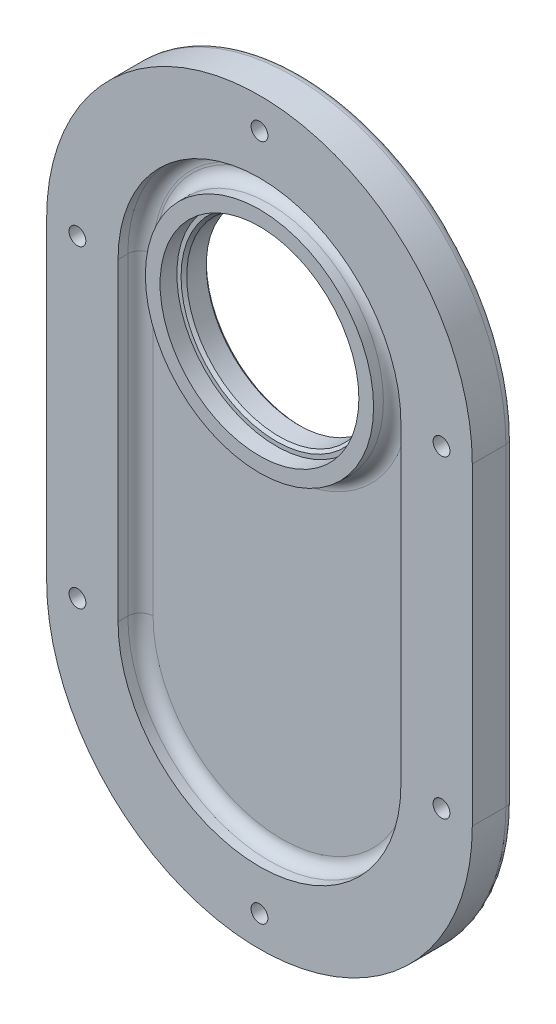
ISO-10303-21;
HEADER;
FILE_DESCRIPTION(('STEP AP214'),'2;1');
FILE_NAME('part.step','',(''),(''),'','','');
FILE_SCHEMA(('AUTOMOTIVE_DESIGN { 1 0 10303 214 1 1 1 1 }'));
ENDSEC;
DATA;
#1=APPLICATION_CONTEXT('core data for automotive mechanical design processes');
#2=APPLICATION_PROTOCOL_DEFINITION('international standard','automotive_design',2000,#1);
#3=PRODUCT_CONTEXT('',#1,'mechanical');
#4=PRODUCT('Part','Part','',(#3));
#5=PRODUCT_RELATED_PRODUCT_CATEGORY('part','',(#4));
#6=PRODUCT_DEFINITION_FORMATION('','',#4);
#7=PRODUCT_DEFINITION_CONTEXT('part definition',#1,'design');
#8=PRODUCT_DEFINITION('design','',#6,#7);
#9=PRODUCT_DEFINITION_SHAPE('','',#8);
#10=(LENGTH_UNIT() NAMED_UNIT(*) SI_UNIT(.MILLI.,.METRE.));
#11=(NAMED_UNIT(*) PLANE_ANGLE_UNIT() SI_UNIT($,.RADIAN.));
#12=(NAMED_UNIT(*) SI_UNIT($,.STERADIAN.) SOLID_ANGLE_UNIT());
#13=UNCERTAINTY_MEASURE_WITH_UNIT(LENGTH_MEASURE(1.E-05),#10,'distance_accuracy_value','');
#14=(GEOMETRIC_REPRESENTATION_CONTEXT(3) GLOBAL_UNCERTAINTY_ASSIGNED_CONTEXT((#13)) GLOBAL_UNIT_ASSIGNED_CONTEXT((#10,
#11,#12)) REPRESENTATION_CONTEXT('',''));
#15=CARTESIAN_POINT('',(0.,0.,0.));
#16=DIRECTION('',(0.,0.,1.));
#17=DIRECTION('',(1.,0.,0.));
#18=AXIS2_PLACEMENT_3D('',#15,#16,#17);
#19=CARTESIAN_POINT('',(0.,0.,0.));
#20=DIRECTION('',(0.,0.,1.));
#21=DIRECTION('',(1.,0.,0.));
#22=AXIS2_PLACEMENT_3D('',#19,#20,#21);
#23=PLANE('',#22);
#24=CARTESIAN_POINT('',(65.,0.,0.));
#25=DIRECTION('',(0.,0.,-1.));
#26=DIRECTION('',(-1.,0.,0.));
#27=AXIS2_PLACEMENT_3D('',#24,#25,#26);
#28=CIRCLE('',#27,7.00000000000001);
#29=CARTESIAN_POINT('',(58.,0.,0.));
#30=VERTEX_POINT('',#29);
#31=EDGE_CURVE('E424',#30,#30,#28,.T.);
#32=ORIENTED_EDGE('',*,*,#31,.F.);
#33=EDGE_LOOP('',(#32));
#34=FACE_BOUND('',#33,.T.);
#35=CARTESIAN_POINT('',(65.,-112.,0.));
#36=DIRECTION('',(0.,0.,-1.));
#37=DIRECTION('',(-1.,0.,0.));
#38=AXIS2_PLACEMENT_3D('',#35,#36,#37);
#39=CIRCLE('',#38,7.00000000000001);
#40=CARTESIAN_POINT('',(58.,-112.,0.));
#41=VERTEX_POINT('',#40);
#42=EDGE_CURVE('E434',#41,#41,#39,.T.);
#43=ORIENTED_EDGE('',*,*,#42,.F.);
#44=EDGE_LOOP('',(#43));
#45=FACE_BOUND('',#44,.T.);
#46=CARTESIAN_POINT('',(-65.,-112.,0.));
#47=DIRECTION('',(0.,0.,-1.));
#48=DIRECTION('',(-1.,0.,0.));
#49=AXIS2_PLACEMENT_3D('',#46,#47,#48);
#50=CIRCLE('',#49,7.00000000000001);
#51=CARTESIAN_POINT('',(-72.,-112.,0.));
#52=VERTEX_POINT('',#51);
#53=EDGE_CURVE('E458',#52,#52,#50,.T.);
#54=ORIENTED_EDGE('',*,*,#53,.F.);
#55=EDGE_LOOP('',(#54));
#56=FACE_BOUND('',#55,.T.);
#57=CARTESIAN_POINT('',(0.,65.,0.));
#58=DIRECTION('',(0.,0.,-1.));
#59=DIRECTION('',(-1.,0.,0.));
#60=AXIS2_PLACEMENT_3D('',#57,#58,#59);
#61=CIRCLE('',#60,7.00000000000001);
#62=CARTESIAN_POINT('',(-7.00000000000001,65.,0.));
#63=VERTEX_POINT('',#62);
#64=EDGE_CURVE('E482',#63,#63,#61,.T.);
#65=ORIENTED_EDGE('',*,*,#64,.F.);
#66=EDGE_LOOP('',(#65));
#67=FACE_BOUND('',#66,.T.);
#68=CARTESIAN_POINT('',(0.,0.,0.));
#69=DIRECTION('',(0.,0.,1.));
#70=DIRECTION('',(1.,0.,0.));
#71=AXIS2_PLACEMENT_3D('',#68,#69,#70);
#72=CIRCLE('',#71,73.);
#73=CARTESIAN_POINT('',(-73.,0.,0.));
#74=VERTEX_POINT('',#73);
#75=CARTESIAN_POINT('',(73.,0.,0.));
#76=VERTEX_POINT('',#75);
#77=EDGE_CURVE('E234',#74,#76,#72,.F.);
#78=ORIENTED_EDGE('',*,*,#77,.T.);
#79=DIRECTION('',(0.,1.,0.));
#80=VECTOR('',#79,1.);
#81=CARTESIAN_POINT('',(73.,0.,0.));
#82=LINE('',#81,#80);
#83=CARTESIAN_POINT('',(73.,-112.,0.));
#84=VERTEX_POINT('',#83);
#85=EDGE_CURVE('E240',#76,#84,#82,.F.);
#86=ORIENTED_EDGE('',*,*,#85,.T.);
#87=CARTESIAN_POINT('',(0.,-112.,0.));
#88=DIRECTION('',(0.,0.,1.));
#89=DIRECTION('',(1.,0.,0.));
#90=AXIS2_PLACEMENT_3D('',#87,#88,#89);
#91=CIRCLE('',#90,73.);
#92=CARTESIAN_POINT('',(-73.,-112.,0.));
#93=VERTEX_POINT('',#92);
#94=EDGE_CURVE('E238',#84,#93,#91,.F.);
#95=ORIENTED_EDGE('',*,*,#94,.T.);
#96=DIRECTION('',(0.,-1.,0.));
#97=VECTOR('',#96,1.);
#98=CARTESIAN_POINT('',(-73.,0.,0.));
#99=LINE('',#98,#97);
#100=EDGE_CURVE('E236',#93,#74,#99,.F.);
#101=ORIENTED_EDGE('',*,*,#100,.T.);
#102=EDGE_LOOP('',(#78,#86,#95,#101));
#103=FACE_BOUND('',#102,.T.);
#104=CARTESIAN_POINT('',(0.,0.,0.));
#105=DIRECTION('',(0.,0.,1.));
#106=DIRECTION('',(1.,0.,0.));
#107=AXIS2_PLACEMENT_3D('',#104,#105,#106);
#108=CIRCLE('',#107,34.);
#109=CARTESIAN_POINT('',(34.,0.,0.));
#110=VERTEX_POINT('',#109);
#111=EDGE_CURVE('E194',#110,#110,#108,.T.);
#112=ORIENTED_EDGE('',*,*,#111,.T.);
#113=EDGE_LOOP('',(#112));
#114=FACE_BOUND('',#113,.T.);
#115=CARTESIAN_POINT('',(0.,-177.,0.));
#116=DIRECTION('',(0.,0.,-1.));
#117=DIRECTION('',(-1.,0.,0.));
#118=AXIS2_PLACEMENT_3D('',#115,#116,#117);
#119=CIRCLE('',#118,7.00000000000001);
#120=CARTESIAN_POINT('',(-7.00000000000002,-177.,0.));
#121=VERTEX_POINT('',#120);
#122=EDGE_CURVE('E470',#121,#121,#119,.T.);
#123=ORIENTED_EDGE('',*,*,#122,.F.);
#124=EDGE_LOOP('',(#123));
#125=FACE_BOUND('',#124,.T.);
#126=CARTESIAN_POINT('',(-65.,0.,0.));
#127=DIRECTION('',(0.,0.,-1.));
#128=DIRECTION('',(-1.,0.,0.));
#129=AXIS2_PLACEMENT_3D('',#126,#127,#128);
#130=CIRCLE('',#129,7.00000000000001);
#131=CARTESIAN_POINT('',(-72.,0.,0.));
#132=VERTEX_POINT('',#131);
#133=EDGE_CURVE('E446',#132,#132,#130,.T.);
#134=ORIENTED_EDGE('',*,*,#133,.F.);
#135=EDGE_LOOP('',(#134));
#136=FACE_BOUND('',#135,.T.);
#137=ADVANCED_FACE('F41',(#34,#45,#56,#67,#103,#114,#125,#136),#23,.F.);
#138=CARTESIAN_POINT('',(0.,0.,15.));
#139=DIRECTION('',(0.,0.,1.));
#140=DIRECTION('',(1.,0.,0.));
#141=AXIS2_PLACEMENT_3D('',#138,#139,#140);
#142=PLANE('',#141);
#143=CARTESIAN_POINT('',(65.,0.,15.));
#144=DIRECTION('',(0.,0.,-1.));
#145=DIRECTION('',(-1.,0.,0.));
#146=AXIS2_PLACEMENT_3D('',#143,#144,#145);
#147=CIRCLE('',#146,3.00000000000002);
#148=CARTESIAN_POINT('',(62.,0.,15.));
#149=VERTEX_POINT('',#148);
#150=EDGE_CURVE('E431',#149,#149,#147,.T.);
#151=ORIENTED_EDGE('',*,*,#150,.T.);
#152=EDGE_LOOP('',(#151));
#153=FACE_BOUND('',#152,.T.);
#154=CARTESIAN_POINT('',(65.,-112.,15.));
#155=DIRECTION('',(0.,0.,-1.));
#156=DIRECTION('',(-1.,0.,0.));
#157=AXIS2_PLACEMENT_3D('',#154,#155,#156);
#158=CIRCLE('',#157,3.00000000000002);
#159=CARTESIAN_POINT('',(62.,-112.,15.));
#160=VERTEX_POINT('',#159);
#161=EDGE_CURVE('E443',#160,#160,#158,.T.);
#162=ORIENTED_EDGE('',*,*,#161,.T.);
#163=EDGE_LOOP('',(#162));
#164=FACE_BOUND('',#163,.T.);
#165=CARTESIAN_POINT('',(-65.,0.,15.));
#166=DIRECTION('',(0.,0.,-1.));
#167=DIRECTION('',(-1.,0.,0.));
#168=AXIS2_PLACEMENT_3D('',#165,#166,#167);
#169=CIRCLE('',#168,3.00000000000001);
#170=CARTESIAN_POINT('',(-68.,0.,15.));
#171=VERTEX_POINT('',#170);
#172=EDGE_CURVE('E455',#171,#171,#169,.T.);
#173=ORIENTED_EDGE('',*,*,#172,.T.);
#174=EDGE_LOOP('',(#173));
#175=FACE_BOUND('',#174,.T.);
#176=CARTESIAN_POINT('',(0.,0.,15.));
#177=DIRECTION('',(0.,0.,1.));
#178=DIRECTION('',(1.,0.,0.));
#179=AXIS2_PLACEMENT_3D('',#176,#177,#178);
#180=CIRCLE('',#179,76.);
#181=CARTESIAN_POINT('',(76.,0.,15.));
#182=VERTEX_POINT('',#181);
#183=CARTESIAN_POINT('',(-76.,0.,15.));
#184=VERTEX_POINT('',#183);
#185=EDGE_CURVE('E165',#182,#184,#180,.T.);
#186=ORIENTED_EDGE('',*,*,#185,.T.);
#187=DIRECTION('',(0.,-1.,0.));
#188=VECTOR('',#187,1.);
#189=CARTESIAN_POINT('',(-76.,0.,15.));
#190=LINE('',#189,#188);
#191=CARTESIAN_POINT('',(-76.,-112.,15.));
#192=VERTEX_POINT('',#191);
#193=EDGE_CURVE('E170',#184,#192,#190,.T.);
#194=ORIENTED_EDGE('',*,*,#193,.T.);
#195=CARTESIAN_POINT('',(0.,-112.,15.));
#196=DIRECTION('',(0.,0.,1.));
#197=DIRECTION('',(1.,0.,0.));
#198=AXIS2_PLACEMENT_3D('',#195,#196,#197);
#199=CIRCLE('',#198,76.);
#200=CARTESIAN_POINT('',(76.,-112.,15.));
#201=VERTEX_POINT('',#200);
#202=EDGE_CURVE('E172',#192,#201,#199,.T.);
#203=ORIENTED_EDGE('',*,*,#202,.T.);
#204=DIRECTION('',(0.,1.,0.));
#205=VECTOR('',#204,1.);
#206=CARTESIAN_POINT('',(76.,0.,15.));
#207=LINE('',#206,#205);
#208=EDGE_CURVE('E174',#201,#182,#207,.T.);
#209=ORIENTED_EDGE('',*,*,#208,.T.);
#210=EDGE_LOOP('',(#186,#194,#203,#209));
#211=FACE_BOUND('',#210,.T.);
#212=CARTESIAN_POINT('',(0.,0.,15.));
#213=DIRECTION('',(0.,0.,1.));
#214=DIRECTION('',(1.,0.,0.));
#215=AXIS2_PLACEMENT_3D('',#212,#213,#214);
#216=CIRCLE('',#215,50.5);
#217=CARTESIAN_POINT('',(50.5,0.,15.));
#218=VERTEX_POINT('',#217);
#219=CARTESIAN_POINT('',(-50.5,0.,15.));
#220=VERTEX_POINT('',#219);
#221=EDGE_CURVE('E153',#218,#220,#216,.T.);
#222=ORIENTED_EDGE('',*,*,#221,.F.);
#223=DIRECTION('',(0.,1.,0.));
#224=VECTOR('',#223,1.);
#225=CARTESIAN_POINT('',(50.5,0.,15.));
#226=LINE('',#225,#224);
#227=CARTESIAN_POINT('',(50.5,-112.,15.));
#228=VERTEX_POINT('',#227);
#229=EDGE_CURVE('E158',#228,#218,#226,.T.);
#230=ORIENTED_EDGE('',*,*,#229,.F.);
#231=CARTESIAN_POINT('',(0.,-112.,15.));
#232=DIRECTION('',(0.,0.,1.));
#233=DIRECTION('',(1.,0.,0.));
#234=AXIS2_PLACEMENT_3D('',#231,#232,#233);
#235=CIRCLE('',#234,50.5);
#236=CARTESIAN_POINT('',(-50.5,-112.,15.));
#237=VERTEX_POINT('',#236);
#238=EDGE_CURVE('E137',#237,#228,#235,.T.);
#239=ORIENTED_EDGE('',*,*,#238,.F.);
#240=DIRECTION('',(0.,-1.,0.));
#241=VECTOR('',#240,1.);
#242=CARTESIAN_POINT('',(-50.5,0.,15.));
#243=LINE('',#242,#241);
#244=EDGE_CURVE('E147',#220,#237,#243,.T.);
#245=ORIENTED_EDGE('',*,*,#244,.F.);
#246=EDGE_LOOP('',(#222,#230,#239,#245));
#247=FACE_BOUND('',#246,.T.);
#248=CARTESIAN_POINT('',(0.,65.,15.));
#249=DIRECTION('',(0.,0.,-1.));
#250=DIRECTION('',(-1.,0.,0.));
#251=AXIS2_PLACEMENT_3D('',#248,#249,#250);
#252=CIRCLE('',#251,3.00000000000001);
#253=CARTESIAN_POINT('',(-3.00000000000001,65.,15.));
#254=VERTEX_POINT('',#253);
#255=EDGE_CURVE('E249',#254,#254,#252,.T.);
#256=ORIENTED_EDGE('',*,*,#255,.T.);
#257=EDGE_LOOP('',(#256));
#258=FACE_BOUND('',#257,.T.);
#259=CARTESIAN_POINT('',(0.,-177.,15.));
#260=DIRECTION('',(0.,0.,-1.));
#261=DIRECTION('',(-1.,0.,0.));
#262=AXIS2_PLACEMENT_3D('',#259,#260,#261);
#263=CIRCLE('',#262,3.00000000000001);
#264=CARTESIAN_POINT('',(-3.00000000000002,-177.,15.));
#265=VERTEX_POINT('',#264);
#266=EDGE_CURVE('E479',#265,#265,#263,.T.);
#267=ORIENTED_EDGE('',*,*,#266,.T.);
#268=EDGE_LOOP('',(#267));
#269=FACE_BOUND('',#268,.T.);
#270=CARTESIAN_POINT('',(-65.,-112.,15.));
#271=DIRECTION('',(0.,0.,-1.));
#272=DIRECTION('',(-1.,0.,0.));
#273=AXIS2_PLACEMENT_3D('',#270,#271,#272);
#274=CIRCLE('',#273,3.00000000000001);
#275=CARTESIAN_POINT('',(-68.,-112.,15.));
#276=VERTEX_POINT('',#275);
#277=EDGE_CURVE('E467',#276,#276,#274,.T.);
#278=ORIENTED_EDGE('',*,*,#277,.T.);
#279=EDGE_LOOP('',(#278));
#280=FACE_BOUND('',#279,.T.);
#281=ADVANCED_FACE('F155',(#153,#164,#175,#211,#247,#258,#269,#280),#142,.T.);
#282=CARTESIAN_POINT('',(0.,0.,15.));
#283=DIRECTION('',(0.,0.,-1.));
#284=DIRECTION('',(-1.,0.,0.));
#285=AXIS2_PLACEMENT_3D('',#282,#283,#284);
#286=CYLINDRICAL_SURFACE('',#285,76.);
#287=DIRECTION('',(0.,0.,-1.));
#288=VECTOR('',#287,1.);
#289=CARTESIAN_POINT('',(76.,0.,15.));
#290=LINE('',#289,#288);
#291=CARTESIAN_POINT('',(76.,0.,3.));
#292=VERTEX_POINT('',#291);
#293=EDGE_CURVE('E176',#182,#292,#290,.T.);
#294=ORIENTED_EDGE('',*,*,#293,.T.);
#295=CARTESIAN_POINT('',(0.,0.,3.));
#296=DIRECTION('',(0.,0.,1.));
#297=DIRECTION('',(1.,0.,0.));
#298=AXIS2_PLACEMENT_3D('',#295,#296,#297);
#299=CIRCLE('',#298,76.);
#300=CARTESIAN_POINT('',(-76.,0.,3.));
#301=VERTEX_POINT('',#300);
#302=EDGE_CURVE('E11',#292,#301,#299,.T.);
#303=ORIENTED_EDGE('',*,*,#302,.T.);
#304=DIRECTION('',(0.,0.,-1.));
#305=VECTOR('',#304,1.);
#306=CARTESIAN_POINT('',(-76.,0.,15.));
#307=LINE('',#306,#305);
#308=EDGE_CURVE('E183',#184,#301,#307,.T.);
#309=ORIENTED_EDGE('',*,*,#308,.F.);
#310=ORIENTED_EDGE('',*,*,#185,.F.);
#311=EDGE_LOOP('',(#294,#303,#309,#310));
#312=FACE_BOUND('',#311,.T.);
#313=ADVANCED_FACE('F278',(#312),#286,.T.);
#314=CARTESIAN_POINT('',(-76.,0.,15.));
#315=DIRECTION('',(1.,0.,0.));
#316=DIRECTION('',(0.,1.,0.));
#317=AXIS2_PLACEMENT_3D('',#314,#315,#316);
#318=PLANE('',#317);
#319=ORIENTED_EDGE('',*,*,#308,.T.);
#320=DIRECTION('',(0.,-1.,0.));
#321=VECTOR('',#320,1.);
#322=CARTESIAN_POINT('',(-76.,0.,3.));
#323=LINE('',#322,#321);
#324=CARTESIAN_POINT('',(-76.,-112.,3.));
#325=VERTEX_POINT('',#324);
#326=EDGE_CURVE('E50',#301,#325,#323,.T.);
#327=ORIENTED_EDGE('',*,*,#326,.T.);
#328=DIRECTION('',(0.,0.,-1.));
#329=VECTOR('',#328,1.);
#330=CARTESIAN_POINT('',(-76.,-112.,15.));
#331=LINE('',#330,#329);
#332=EDGE_CURVE('E181',#192,#325,#331,.T.);
#333=ORIENTED_EDGE('',*,*,#332,.F.);
#334=ORIENTED_EDGE('',*,*,#193,.F.);
#335=EDGE_LOOP('',(#319,#327,#333,#334));
#336=FACE_BOUND('',#335,.T.);
#337=ADVANCED_FACE('F283',(#336),#318,.F.);
#338=CARTESIAN_POINT('',(0.,-112.,15.));
#339=DIRECTION('',(0.,0.,-1.));
#340=DIRECTION('',(-1.,0.,0.));
#341=AXIS2_PLACEMENT_3D('',#338,#339,#340);
#342=CYLINDRICAL_SURFACE('',#341,76.);
#343=ORIENTED_EDGE('',*,*,#332,.T.);
#344=CARTESIAN_POINT('',(0.,-112.,3.));
#345=DIRECTION('',(0.,0.,1.));
#346=DIRECTION('',(1.,0.,0.));
#347=AXIS2_PLACEMENT_3D('',#344,#345,#346);
#348=CIRCLE('',#347,76.);
#349=CARTESIAN_POINT('',(76.,-112.,3.));
#350=VERTEX_POINT('',#349);
#351=EDGE_CURVE('E243',#325,#350,#348,.T.);
#352=ORIENTED_EDGE('',*,*,#351,.T.);
#353=DIRECTION('',(0.,0.,-1.));
#354=VECTOR('',#353,1.);
#355=CARTESIAN_POINT('',(76.,-112.,15.));
#356=LINE('',#355,#354);
#357=EDGE_CURVE('E178',#201,#350,#356,.T.);
#358=ORIENTED_EDGE('',*,*,#357,.F.);
#359=ORIENTED_EDGE('',*,*,#202,.F.);
#360=EDGE_LOOP('',(#343,#352,#358,#359));
#361=FACE_BOUND('',#360,.T.);
#362=ADVANCED_FACE('F282',(#361),#342,.T.);
#363=CARTESIAN_POINT('',(76.,0.,15.));
#364=DIRECTION('',(-1.,0.,0.));
#365=DIRECTION('',(0.,-1.,0.));
#366=AXIS2_PLACEMENT_3D('',#363,#364,#365);
#367=PLANE('',#366);
#368=ORIENTED_EDGE('',*,*,#357,.T.);
#369=DIRECTION('',(0.,1.,0.));
#370=VECTOR('',#369,1.);
#371=CARTESIAN_POINT('',(76.,0.,3.));
#372=LINE('',#371,#370);
#373=EDGE_CURVE('E220',#350,#292,#372,.T.);
#374=ORIENTED_EDGE('',*,*,#373,.T.);
#375=ORIENTED_EDGE('',*,*,#293,.F.);
#376=ORIENTED_EDGE('',*,*,#208,.F.);
#377=EDGE_LOOP('',(#368,#374,#375,#376));
#378=FACE_BOUND('',#377,.T.);
#379=ADVANCED_FACE('F274',(#378),#367,.F.);
#380=CARTESIAN_POINT('',(0.,0.,7.));
#381=DIRECTION('',(0.,0.,1.));
#382=DIRECTION('',(1.,0.,0.));
#383=AXIS2_PLACEMENT_3D('',#380,#381,#382);
#384=CYLINDRICAL_SURFACE('',#383,50.5);
#385=DIRECTION('',(0.,0.,1.));
#386=VECTOR('',#385,1.);
#387=CARTESIAN_POINT('',(-50.5,0.,7.));
#388=LINE('',#387,#386);
#389=CARTESIAN_POINT('',(-50.5,0.,11.5));
#390=VERTEX_POINT('',#389);
#391=EDGE_CURVE('E144',#390,#220,#388,.T.);
#392=ORIENTED_EDGE('',*,*,#391,.F.);
#393=CARTESIAN_POINT('',(0.,0.,11.5));
#394=DIRECTION('',(0.,0.,1.));
#395=DIRECTION('',(1.,0.,0.));
#396=AXIS2_PLACEMENT_3D('',#393,#394,#395);
#397=CIRCLE('',#396,50.5);
#398=CARTESIAN_POINT('',(50.5,0.,11.5));
#399=VERTEX_POINT('',#398);
#400=EDGE_CURVE('E215',#390,#399,#397,.F.);
#401=ORIENTED_EDGE('',*,*,#400,.T.);
#402=DIRECTION('',(0.,0.,1.));
#403=VECTOR('',#402,1.);
#404=CARTESIAN_POINT('',(50.5,0.,7.));
#405=LINE('',#404,#403);
#406=EDGE_CURVE('E163',#399,#218,#405,.T.);
#407=ORIENTED_EDGE('',*,*,#406,.T.);
#408=ORIENTED_EDGE('',*,*,#221,.T.);
#409=EDGE_LOOP('',(#392,#401,#407,#408));
#410=FACE_BOUND('',#409,.T.);
#411=ADVANCED_FACE('F307',(#410),#384,.F.);
#412=CARTESIAN_POINT('',(50.5,0.,7.));
#413=DIRECTION('',(1.,0.,0.));
#414=DIRECTION('',(0.,1.,0.));
#415=AXIS2_PLACEMENT_3D('',#412,#413,#414);
#416=PLANE('',#415);
#417=ORIENTED_EDGE('',*,*,#406,.F.);
#418=DIRECTION('',(0.,1.,0.));
#419=VECTOR('',#418,1.);
#420=CARTESIAN_POINT('',(50.5,0.,11.5));
#421=LINE('',#420,#419);
#422=CARTESIAN_POINT('',(50.5,-112.,11.5));
#423=VERTEX_POINT('',#422);
#424=EDGE_CURVE('E209',#399,#423,#421,.F.);
#425=ORIENTED_EDGE('',*,*,#424,.T.);
#426=DIRECTION('',(0.,0.,1.));
#427=VECTOR('',#426,1.);
#428=CARTESIAN_POINT('',(50.5,-112.,7.));
#429=LINE('',#428,#427);
#430=EDGE_CURVE('E143',#423,#228,#429,.T.);
#431=ORIENTED_EDGE('',*,*,#430,.T.);
#432=ORIENTED_EDGE('',*,*,#229,.T.);
#433=EDGE_LOOP('',(#417,#425,#431,#432));
#434=FACE_BOUND('',#433,.T.);
#435=ADVANCED_FACE('F312',(#434),#416,.F.);
#436=CARTESIAN_POINT('',(0.,-112.,7.));
#437=DIRECTION('',(0.,0.,1.));
#438=DIRECTION('',(1.,0.,0.));
#439=AXIS2_PLACEMENT_3D('',#436,#437,#438);
#440=CYLINDRICAL_SURFACE('',#439,50.5);
#441=ORIENTED_EDGE('',*,*,#430,.F.);
#442=CARTESIAN_POINT('',(0.,-112.,11.5));
#443=DIRECTION('',(0.,0.,1.));
#444=DIRECTION('',(1.,0.,0.));
#445=AXIS2_PLACEMENT_3D('',#442,#443,#444);
#446=CIRCLE('',#445,50.5);
#447=CARTESIAN_POINT('',(-50.5,-112.,11.5));
#448=VERTEX_POINT('',#447);
#449=EDGE_CURVE('E140',#423,#448,#446,.F.);
#450=ORIENTED_EDGE('',*,*,#449,.T.);
#451=DIRECTION('',(0.,0.,1.));
#452=VECTOR('',#451,1.);
#453=CARTESIAN_POINT('',(-50.5,-112.,7.));
#454=LINE('',#453,#452);
#455=EDGE_CURVE('E132',#448,#237,#454,.T.);
#456=ORIENTED_EDGE('',*,*,#455,.T.);
#457=ORIENTED_EDGE('',*,*,#238,.T.);
#458=EDGE_LOOP('',(#441,#450,#456,#457));
#459=FACE_BOUND('',#458,.T.);
#460=ADVANCED_FACE('F135',(#459),#440,.F.);
#461=CARTESIAN_POINT('',(-50.5,0.,7.));
#462=DIRECTION('',(-1.,0.,0.));
#463=DIRECTION('',(0.,-1.,0.));
#464=AXIS2_PLACEMENT_3D('',#461,#462,#463);
#465=PLANE('',#464);
#466=ORIENTED_EDGE('',*,*,#455,.F.);
#467=DIRECTION('',(0.,-1.,0.));
#468=VECTOR('',#467,1.);
#469=CARTESIAN_POINT('',(-50.5,0.,11.5));
#470=LINE('',#469,#468);
#471=EDGE_CURVE('E213',#448,#390,#470,.F.);
#472=ORIENTED_EDGE('',*,*,#471,.T.);
#473=ORIENTED_EDGE('',*,*,#391,.T.);
#474=ORIENTED_EDGE('',*,*,#244,.T.);
#475=EDGE_LOOP('',(#466,#472,#473,#474));
#476=FACE_BOUND('',#475,.T.);
#477=ADVANCED_FACE('F148',(#476),#465,.F.);
#478=CARTESIAN_POINT('',(0.,0.,7.));
#479=DIRECTION('',(0.,0.,1.));
#480=DIRECTION('',(1.,0.,0.));
#481=AXIS2_PLACEMENT_3D('',#478,#479,#480);
#482=PLANE('',#481);
#483=CARTESIAN_POINT('',(0.,-112.,7.));
#484=DIRECTION('',(0.,0.,1.));
#485=DIRECTION('',(1.,0.,0.));
#486=AXIS2_PLACEMENT_3D('',#483,#484,#485);
#487=CIRCLE('',#486,46.);
#488=CARTESIAN_POINT('',(-46.,-112.,7.));
#489=VERTEX_POINT('',#488);
#490=CARTESIAN_POINT('',(46.,-112.,7.));
#491=VERTEX_POINT('',#490);
#492=EDGE_CURVE('E204',#489,#491,#487,.T.);
#493=ORIENTED_EDGE('',*,*,#492,.T.);
#494=DIRECTION('',(0.,1.,0.));
#495=VECTOR('',#494,1.);
#496=CARTESIAN_POINT('',(46.,0.,7.));
#497=LINE('',#496,#495);
#498=CARTESIAN_POINT('',(46.,0.,7.));
#499=VERTEX_POINT('',#498);
#500=EDGE_CURVE('E206',#491,#499,#497,.T.);
#501=ORIENTED_EDGE('',*,*,#500,.T.);
#502=CARTESIAN_POINT('',(0.,0.,7.));
#503=DIRECTION('',(0.,0.,1.));
#504=DIRECTION('',(1.,0.,0.));
#505=AXIS2_PLACEMENT_3D('',#502,#503,#504);
#506=CIRCLE('',#505,46.);
#507=CARTESIAN_POINT('',(-46.,0.,7.));
#508=VERTEX_POINT('',#507);
#509=EDGE_CURVE('E200',#499,#508,#506,.T.);
#510=ORIENTED_EDGE('',*,*,#509,.T.);
#511=DIRECTION('',(0.,-1.,0.));
#512=VECTOR('',#511,1.);
#513=CARTESIAN_POINT('',(-46.,0.,7.));
#514=LINE('',#513,#512);
#515=EDGE_CURVE('E202',#508,#489,#514,.T.);
#516=ORIENTED_EDGE('',*,*,#515,.T.);
#517=EDGE_LOOP('',(#493,#501,#510,#516));
#518=FACE_BOUND('',#517,.T.);
#519=CARTESIAN_POINT('',(0.,0.,7.));
#520=DIRECTION('',(0.,0.,1.));
#521=DIRECTION('',(1.,0.,0.));
#522=AXIS2_PLACEMENT_3D('',#519,#520,#521);
#523=CIRCLE('',#522,45.25);
#524=CARTESIAN_POINT('',(45.25,0.,7.));
#525=VERTEX_POINT('',#524);
#526=EDGE_CURVE('E197',#525,#525,#523,.F.);
#527=ORIENTED_EDGE('',*,*,#526,.T.);
#528=EDGE_LOOP('',(#527));
#529=FACE_BOUND('',#528,.T.);
#530=ADVANCED_FACE('F323',(#518,#529),#482,.T.);
#531=CARTESIAN_POINT('',(0.,0.,7.));
#532=DIRECTION('',(0.,0.,1.));
#533=DIRECTION('',(1.,0.,0.));
#534=AXIS2_PLACEMENT_3D('',#531,#532,#533);
#535=CYLINDRICAL_SURFACE('',#534,40.75);
#536=CARTESIAN_POINT('',(0.,0.,11.5));
#537=DIRECTION('',(0.,0.,1.));
#538=DIRECTION('',(1.,0.,0.));
#539=AXIS2_PLACEMENT_3D('',#536,#537,#538);
#540=CIRCLE('',#539,40.75);
#541=CARTESIAN_POINT('',(40.75,0.,11.5));
#542=VERTEX_POINT('',#541);
#543=EDGE_CURVE('E217',#542,#542,#540,.T.);
#544=ORIENTED_EDGE('',*,*,#543,.T.);
#545=EDGE_LOOP('',(#544));
#546=FACE_BOUND('',#545,.T.);
#547=CARTESIAN_POINT('',(0.,0.,15.));
#548=DIRECTION('',(0.,0.,1.));
#549=DIRECTION('',(1.,0.,0.));
#550=AXIS2_PLACEMENT_3D('',#547,#548,#549);
#551=CIRCLE('',#550,40.75);
#552=CARTESIAN_POINT('',(40.75,0.,15.));
#553=VERTEX_POINT('',#552);
#554=EDGE_CURVE('E496',#553,#553,#551,.T.);
#555=ORIENTED_EDGE('',*,*,#554,.F.);
#556=EDGE_LOOP('',(#555));
#557=FACE_BOUND('',#556,.T.);
#558=ADVANCED_FACE('F328',(#546,#557),#535,.T.);
#559=CARTESIAN_POINT('',(0.,0.,15.));
#560=DIRECTION('',(0.,0.,1.));
#561=DIRECTION('',(1.,0.,0.));
#562=AXIS2_PLACEMENT_3D('',#559,#560,#561);
#563=CIRCLE('',#562,35.5);
#564=CARTESIAN_POINT('',(35.5,0.,15.));
#565=VERTEX_POINT('',#564);
#566=EDGE_CURVE('E231',#565,#565,#563,.T.);
#567=ORIENTED_EDGE('',*,*,#566,.F.);
#568=EDGE_LOOP('',(#567));
#569=FACE_BOUND('',#568,.T.);
#570=ORIENTED_EDGE('',*,*,#554,.T.);
#571=EDGE_LOOP('',(#570));
#572=FACE_BOUND('',#571,.T.);
#573=ADVANCED_FACE('F301',(#569,#572),#142,.T.);
#574=CARTESIAN_POINT('',(0.,0.,9.));
#575=DIRECTION('',(0.,0.,1.));
#576=DIRECTION('',(1.,0.,0.));
#577=AXIS2_PLACEMENT_3D('',#574,#575,#576);
#578=CYLINDRICAL_SURFACE('',#577,35.5);
#579=CARTESIAN_POINT('',(0.,0.,9.));
#580=DIRECTION('',(0.,0.,1.));
#581=DIRECTION('',(1.,0.,0.));
#582=AXIS2_PLACEMENT_3D('',#579,#580,#581);
#583=CIRCLE('',#582,35.5);
#584=CARTESIAN_POINT('',(35.5,0.,9.));
#585=VERTEX_POINT('',#584);
#586=EDGE_CURVE('E493',#585,#585,#583,.T.);
#587=ORIENTED_EDGE('',*,*,#586,.F.);
#588=EDGE_LOOP('',(#587));
#589=FACE_BOUND('',#588,.T.);
#590=ORIENTED_EDGE('',*,*,#566,.T.);
#591=EDGE_LOOP('',(#590));
#592=FACE_BOUND('',#591,.T.);
#593=ADVANCED_FACE('F333',(#589,#592),#578,.F.);
#594=CARTESIAN_POINT('',(0.,0.,9.));
#595=DIRECTION('',(0.,0.,1.));
#596=DIRECTION('',(1.,0.,0.));
#597=AXIS2_PLACEMENT_3D('',#594,#595,#596);
#598=PLANE('',#597);
#599=CARTESIAN_POINT('',(0.,0.,9.));
#600=DIRECTION('',(0.,0.,1.));
#601=DIRECTION('',(1.,0.,0.));
#602=AXIS2_PLACEMENT_3D('',#599,#600,#601);
#603=CIRCLE('',#602,34.);
#604=CARTESIAN_POINT('',(34.,0.,9.));
#605=VERTEX_POINT('',#604);
#606=EDGE_CURVE('E191',#605,#605,#603,.F.);
#607=ORIENTED_EDGE('',*,*,#606,.T.);
#608=EDGE_LOOP('',(#607));
#609=FACE_BOUND('',#608,.T.);
#610=ORIENTED_EDGE('',*,*,#586,.T.);
#611=EDGE_LOOP('',(#610));
#612=FACE_BOUND('',#611,.T.);
#613=ADVANCED_FACE('F336',(#609,#612),#598,.T.);
#614=CARTESIAN_POINT('',(0.,0.,0.));
#615=DIRECTION('',(0.,0.,1.));
#616=DIRECTION('',(1.,0.,0.));
#617=AXIS2_PLACEMENT_3D('',#614,#615,#616);
#618=CYLINDRICAL_SURFACE('',#617,33.);
#619=CARTESIAN_POINT('',(0.,0.,7.99999999999999));
#620=DIRECTION('',(0.,0.,1.));
#621=DIRECTION('',(1.,0.,0.));
#622=AXIS2_PLACEMENT_3D('',#619,#620,#621);
#623=CIRCLE('',#622,33.);
#624=CARTESIAN_POINT('',(33.,0.,7.99999999999999));
#625=VERTEX_POINT('',#624);
#626=EDGE_CURVE('E188',#625,#625,#623,.T.);
#627=ORIENTED_EDGE('',*,*,#626,.T.);
#628=EDGE_LOOP('',(#627));
#629=FACE_BOUND('',#628,.T.);
#630=CARTESIAN_POINT('',(0.,0.,0.999999999999973));
#631=DIRECTION('',(0.,0.,1.));
#632=DIRECTION('',(1.,0.,0.));
#633=AXIS2_PLACEMENT_3D('',#630,#631,#632);
#634=CIRCLE('',#633,33.);
#635=CARTESIAN_POINT('',(33.,0.,0.999999999999973));
#636=VERTEX_POINT('',#635);
#637=EDGE_CURVE('E185',#636,#636,#634,.F.);
#638=ORIENTED_EDGE('',*,*,#637,.T.);
#639=EDGE_LOOP('',(#638));
#640=FACE_BOUND('',#639,.T.);
#641=ADVANCED_FACE('F340',(#629,#640),#618,.F.);
#642=CARTESIAN_POINT('',(0.,0.,7.99999999999999));
#643=DIRECTION('',(0.,0.,1.));
#644=DIRECTION('',(1.,0.,0.));
#645=AXIS2_PLACEMENT_3D('',#642,#643,#644);
#646=CONICAL_SURFACE('',#645,33.,0.785398163397448);
#647=ORIENTED_EDGE('',*,*,#606,.F.);
#648=EDGE_LOOP('',(#647));
#649=FACE_BOUND('',#648,.T.);
#650=ORIENTED_EDGE('',*,*,#626,.F.);
#651=EDGE_LOOP('',(#650));
#652=FACE_BOUND('',#651,.T.);
#653=ADVANCED_FACE('F344',(#649,#652),#646,.F.);
#654=CARTESIAN_POINT('',(0.,0.,0.));
#655=DIRECTION('',(0.,0.,-1.));
#656=DIRECTION('',(-1.,0.,0.));
#657=AXIS2_PLACEMENT_3D('',#654,#655,#656);
#658=CONICAL_SURFACE('',#657,34.,0.785398163397438);
#659=ORIENTED_EDGE('',*,*,#637,.F.);
#660=EDGE_LOOP('',(#659));
#661=FACE_BOUND('',#660,.T.);
#662=ORIENTED_EDGE('',*,*,#111,.F.);
#663=EDGE_LOOP('',(#662));
#664=FACE_BOUND('',#663,.T.);
#665=ADVANCED_FACE('F521',(#661,#664),#658,.F.);
#666=CARTESIAN_POINT('',(-46.,0.,11.5));
#667=DIRECTION('',(0.,-1.,0.));
#668=DIRECTION('',(1.,0.,0.));
#669=AXIS2_PLACEMENT_3D('',#666,#667,#668);
#670=CYLINDRICAL_SURFACE('',#669,4.5);
#671=CARTESIAN_POINT('',(-46.,0.,11.5));
#672=DIRECTION('',(0.,-1.,0.));
#673=DIRECTION('',(1.,0.,0.));
#674=AXIS2_PLACEMENT_3D('',#671,#672,#673);
#675=CIRCLE('',#674,4.5);
#676=EDGE_CURVE('E225',#390,#508,#675,.T.);
#677=ORIENTED_EDGE('',*,*,#676,.F.);
#678=ORIENTED_EDGE('',*,*,#471,.F.);
#679=CARTESIAN_POINT('',(-46.,-112.,11.5));
#680=DIRECTION('',(0.,1.,0.));
#681=DIRECTION('',(0.,0.,1.));
#682=AXIS2_PLACEMENT_3D('',#679,#680,#681);
#683=CIRCLE('',#682,4.5);
#684=EDGE_CURVE('E228',#489,#448,#683,.T.);
#685=ORIENTED_EDGE('',*,*,#684,.F.);
#686=ORIENTED_EDGE('',*,*,#515,.F.);
#687=EDGE_LOOP('',(#677,#678,#685,#686));
#688=FACE_BOUND('',#687,.T.);
#689=ADVANCED_FACE('F519',(#688),#670,.F.);
#690=CARTESIAN_POINT('',(0.,-112.,11.5));
#691=DIRECTION('',(0.,0.,1.));
#692=DIRECTION('',(1.,0.,0.));
#693=AXIS2_PLACEMENT_3D('',#690,#691,#692);
#694=TOROIDAL_SURFACE('',#693,46.,4.5);
#695=ORIENTED_EDGE('',*,*,#684,.T.);
#696=ORIENTED_EDGE('',*,*,#449,.F.);
#697=CARTESIAN_POINT('',(46.,-112.,11.5));
#698=DIRECTION('',(0.,-1.,0.));
#699=DIRECTION('',(0.,0.,-1.));
#700=AXIS2_PLACEMENT_3D('',#697,#698,#699);
#701=CIRCLE('',#700,4.5);
#702=EDGE_CURVE('E223',#491,#423,#701,.T.);
#703=ORIENTED_EDGE('',*,*,#702,.F.);
#704=ORIENTED_EDGE('',*,*,#492,.F.);
#705=EDGE_LOOP('',(#695,#696,#703,#704));
#706=FACE_BOUND('',#705,.T.);
#707=ADVANCED_FACE('F517',(#706),#694,.F.);
#708=CARTESIAN_POINT('',(0.,0.,11.5));
#709=DIRECTION('',(0.,0.,1.));
#710=DIRECTION('',(1.,0.,0.));
#711=AXIS2_PLACEMENT_3D('',#708,#709,#710);
#712=TOROIDAL_SURFACE('',#711,46.,4.5);
#713=ORIENTED_EDGE('',*,*,#676,.T.);
#714=ORIENTED_EDGE('',*,*,#509,.F.);
#715=CARTESIAN_POINT('',(46.,0.,11.5));
#716=DIRECTION('',(0.,1.,0.));
#717=DIRECTION('',(-1.,0.,0.));
#718=AXIS2_PLACEMENT_3D('',#715,#716,#717);
#719=CIRCLE('',#718,4.5);
#720=EDGE_CURVE('E221',#399,#499,#719,.T.);
#721=ORIENTED_EDGE('',*,*,#720,.F.);
#722=ORIENTED_EDGE('',*,*,#400,.F.);
#723=EDGE_LOOP('',(#713,#714,#721,#722));
#724=FACE_BOUND('',#723,.T.);
#725=ADVANCED_FACE('F511',(#724),#712,.F.);
#726=CARTESIAN_POINT('',(46.,0.,11.5));
#727=DIRECTION('',(0.,1.,0.));
#728=DIRECTION('',(-1.,0.,0.));
#729=AXIS2_PLACEMENT_3D('',#726,#727,#728);
#730=CYLINDRICAL_SURFACE('',#729,4.5);
#731=ORIENTED_EDGE('',*,*,#702,.T.);
#732=ORIENTED_EDGE('',*,*,#424,.F.);
#733=ORIENTED_EDGE('',*,*,#720,.T.);
#734=ORIENTED_EDGE('',*,*,#500,.F.);
#735=EDGE_LOOP('',(#731,#732,#733,#734));
#736=FACE_BOUND('',#735,.T.);
#737=ADVANCED_FACE('F506',(#736),#730,.F.);
#738=CARTESIAN_POINT('',(0.,0.,11.5));
#739=DIRECTION('',(0.,0.,1.));
#740=DIRECTION('',(1.,0.,0.));
#741=AXIS2_PLACEMENT_3D('',#738,#739,#740);
#742=TOROIDAL_SURFACE('',#741,45.25,4.5);
#743=ORIENTED_EDGE('',*,*,#526,.F.);
#744=EDGE_LOOP('',(#743));
#745=FACE_BOUND('',#744,.T.);
#746=ORIENTED_EDGE('',*,*,#543,.F.);
#747=EDGE_LOOP('',(#746));
#748=FACE_BOUND('',#747,.T.);
#749=ADVANCED_FACE('F531',(#745,#748),#742,.F.);
#750=CARTESIAN_POINT('',(-73.,0.,3.));
#751=DIRECTION('',(0.,-1.,0.));
#752=DIRECTION('',(1.,0.,0.));
#753=AXIS2_PLACEMENT_3D('',#750,#751,#752);
#754=CYLINDRICAL_SURFACE('',#753,3.);
#755=CARTESIAN_POINT('',(-73.,0.,3.));
#756=DIRECTION('',(0.,1.,0.));
#757=DIRECTION('',(-1.,0.,0.));
#758=AXIS2_PLACEMENT_3D('',#755,#756,#757);
#759=CIRCLE('',#758,3.);
#760=EDGE_CURVE('E250',#74,#301,#759,.T.);
#761=ORIENTED_EDGE('',*,*,#760,.F.);
#762=ORIENTED_EDGE('',*,*,#100,.F.);
#763=CARTESIAN_POINT('',(-73.,-112.,3.));
#764=DIRECTION('',(0.,-1.,0.));
#765=DIRECTION('',(0.,0.,-1.));
#766=AXIS2_PLACEMENT_3D('',#763,#764,#765);
#767=CIRCLE('',#766,3.);
#768=EDGE_CURVE('E45',#325,#93,#767,.T.);
#769=ORIENTED_EDGE('',*,*,#768,.F.);
#770=ORIENTED_EDGE('',*,*,#326,.F.);
#771=EDGE_LOOP('',(#761,#762,#769,#770));
#772=FACE_BOUND('',#771,.T.);
#773=ADVANCED_FACE('F43',(#772),#754,.T.);
#774=CARTESIAN_POINT('',(0.,-112.,3.));
#775=DIRECTION('',(0.,0.,1.));
#776=DIRECTION('',(1.,0.,0.));
#777=AXIS2_PLACEMENT_3D('',#774,#775,#776);
#778=TOROIDAL_SURFACE('',#777,73.,3.);
#779=ORIENTED_EDGE('',*,*,#768,.T.);
#780=ORIENTED_EDGE('',*,*,#94,.F.);
#781=CARTESIAN_POINT('',(73.,-112.,3.));
#782=DIRECTION('',(0.,1.,0.));
#783=DIRECTION('',(0.,0.,1.));
#784=AXIS2_PLACEMENT_3D('',#781,#782,#783);
#785=CIRCLE('',#784,3.);
#786=EDGE_CURVE('E248',#350,#84,#785,.T.);
#787=ORIENTED_EDGE('',*,*,#786,.F.);
#788=ORIENTED_EDGE('',*,*,#351,.F.);
#789=EDGE_LOOP('',(#779,#780,#787,#788));
#790=FACE_BOUND('',#789,.T.);
#791=ADVANCED_FACE('F260',(#790),#778,.T.);
#792=CARTESIAN_POINT('',(0.,0.,3.));
#793=DIRECTION('',(0.,0.,1.));
#794=DIRECTION('',(1.,0.,0.));
#795=AXIS2_PLACEMENT_3D('',#792,#793,#794);
#796=TOROIDAL_SURFACE('',#795,73.,3.);
#797=ORIENTED_EDGE('',*,*,#760,.T.);
#798=ORIENTED_EDGE('',*,*,#302,.F.);
#799=CARTESIAN_POINT('',(73.,0.,3.));
#800=DIRECTION('',(0.,-1.,0.));
#801=DIRECTION('',(1.,0.,0.));
#802=AXIS2_PLACEMENT_3D('',#799,#800,#801);
#803=CIRCLE('',#802,3.);
#804=EDGE_CURVE('E246',#76,#292,#803,.T.);
#805=ORIENTED_EDGE('',*,*,#804,.F.);
#806=ORIENTED_EDGE('',*,*,#77,.F.);
#807=EDGE_LOOP('',(#797,#798,#805,#806));
#808=FACE_BOUND('',#807,.T.);
#809=ADVANCED_FACE('F271',(#808),#796,.T.);
#810=CARTESIAN_POINT('',(73.,0.,3.));
#811=DIRECTION('',(0.,1.,0.));
#812=DIRECTION('',(-1.,0.,0.));
#813=AXIS2_PLACEMENT_3D('',#810,#811,#812);
#814=CYLINDRICAL_SURFACE('',#813,3.);
#815=ORIENTED_EDGE('',*,*,#786,.T.);
#816=ORIENTED_EDGE('',*,*,#85,.F.);
#817=ORIENTED_EDGE('',*,*,#804,.T.);
#818=ORIENTED_EDGE('',*,*,#373,.F.);
#819=EDGE_LOOP('',(#815,#816,#817,#818));
#820=FACE_BOUND('',#819,.T.);
#821=ADVANCED_FACE('F269',(#820),#814,.T.);
#822=CARTESIAN_POINT('',(0.,65.,0.));
#823=DIRECTION('',(0.,0.,-1.));
#824=DIRECTION('',(-1.,0.,0.));
#825=AXIS2_PLACEMENT_3D('',#822,#823,#824);
#826=CYLINDRICAL_SURFACE('',#825,3.00000000000001);
#827=ORIENTED_EDGE('',*,*,#255,.F.);
#828=EDGE_LOOP('',(#827));
#829=FACE_BOUND('',#828,.T.);
#830=CARTESIAN_POINT('',(0.,65.,10.));
#831=DIRECTION('',(0.,0.,-1.));
#832=DIRECTION('',(-1.,0.,0.));
#833=AXIS2_PLACEMENT_3D('',#830,#831,#832);
#834=CIRCLE('',#833,3.00000000000001);
#835=CARTESIAN_POINT('',(-3.00000000000001,65.,10.));
#836=VERTEX_POINT('',#835);
#837=EDGE_CURVE('E488',#836,#836,#834,.T.);
#838=ORIENTED_EDGE('',*,*,#837,.T.);
#839=EDGE_LOOP('',(#838));
#840=FACE_BOUND('',#839,.T.);
#841=ADVANCED_FACE('F346',(#829,#840),#826,.F.);
#842=CARTESIAN_POINT('',(3.00000000000002,65.,10.));
#843=DIRECTION('',(0.,0.,1.));
#844=DIRECTION('',(1.,0.,0.));
#845=AXIS2_PLACEMENT_3D('',#842,#843,#844);
#846=PLANE('',#845);
#847=ORIENTED_EDGE('',*,*,#837,.F.);
#848=EDGE_LOOP('',(#847));
#849=FACE_BOUND('',#848,.T.);
#850=CARTESIAN_POINT('',(0.,65.,10.));
#851=DIRECTION('',(0.,0.,-1.));
#852=DIRECTION('',(-1.,0.,0.));
#853=AXIS2_PLACEMENT_3D('',#850,#851,#852);
#854=CIRCLE('',#853,7.00000000000001);
#855=CARTESIAN_POINT('',(-7.00000000000001,65.,10.));
#856=VERTEX_POINT('',#855);
#857=EDGE_CURVE('E485',#856,#856,#854,.T.);
#858=ORIENTED_EDGE('',*,*,#857,.T.);
#859=EDGE_LOOP('',(#858));
#860=FACE_BOUND('',#859,.T.);
#861=ADVANCED_FACE('F349',(#849,#860),#846,.F.);
#862=CARTESIAN_POINT('',(0.,65.,0.));
#863=DIRECTION('',(0.,0.,-1.));
#864=DIRECTION('',(-1.,0.,0.));
#865=AXIS2_PLACEMENT_3D('',#862,#863,#864);
#866=CYLINDRICAL_SURFACE('',#865,7.00000000000001);
#867=ORIENTED_EDGE('',*,*,#857,.F.);
#868=EDGE_LOOP('',(#867));
#869=FACE_BOUND('',#868,.T.);
#870=ORIENTED_EDGE('',*,*,#64,.T.);
#871=EDGE_LOOP('',(#870));
#872=FACE_BOUND('',#871,.T.);
#873=ADVANCED_FACE('F353',(#869,#872),#866,.F.);
#874=CARTESIAN_POINT('',(0.,-177.,0.));
#875=DIRECTION('',(0.,0.,-1.));
#876=DIRECTION('',(-1.,0.,0.));
#877=AXIS2_PLACEMENT_3D('',#874,#875,#876);
#878=CYLINDRICAL_SURFACE('',#877,3.00000000000001);
#879=ORIENTED_EDGE('',*,*,#266,.F.);
#880=EDGE_LOOP('',(#879));
#881=FACE_BOUND('',#880,.T.);
#882=CARTESIAN_POINT('',(0.,-177.,10.));
#883=DIRECTION('',(0.,0.,-1.));
#884=DIRECTION('',(-1.,0.,0.));
#885=AXIS2_PLACEMENT_3D('',#882,#883,#884);
#886=CIRCLE('',#885,3.00000000000001);
#887=CARTESIAN_POINT('',(-3.00000000000002,-177.,10.));
#888=VERTEX_POINT('',#887);
#889=EDGE_CURVE('E476',#888,#888,#886,.T.);
#890=ORIENTED_EDGE('',*,*,#889,.T.);
#891=EDGE_LOOP('',(#890));
#892=FACE_BOUND('',#891,.T.);
#893=ADVANCED_FACE('F357',(#881,#892),#878,.F.);
#894=CARTESIAN_POINT('',(3.00000000000001,-177.,10.));
#895=DIRECTION('',(0.,0.,1.));
#896=DIRECTION('',(1.,0.,0.));
#897=AXIS2_PLACEMENT_3D('',#894,#895,#896);
#898=PLANE('',#897);
#899=ORIENTED_EDGE('',*,*,#889,.F.);
#900=EDGE_LOOP('',(#899));
#901=FACE_BOUND('',#900,.T.);
#902=CARTESIAN_POINT('',(0.,-177.,10.));
#903=DIRECTION('',(0.,0.,-1.));
#904=DIRECTION('',(-1.,0.,0.));
#905=AXIS2_PLACEMENT_3D('',#902,#903,#904);
#906=CIRCLE('',#905,7.00000000000001);
#907=CARTESIAN_POINT('',(-7.00000000000002,-177.,10.));
#908=VERTEX_POINT('',#907);
#909=EDGE_CURVE('E473',#908,#908,#906,.T.);
#910=ORIENTED_EDGE('',*,*,#909,.T.);
#911=EDGE_LOOP('',(#910));
#912=FACE_BOUND('',#911,.T.);
#913=ADVANCED_FACE('F361',(#901,#912),#898,.F.);
#914=CARTESIAN_POINT('',(0.,-177.,0.));
#915=DIRECTION('',(0.,0.,-1.));
#916=DIRECTION('',(-1.,0.,0.));
#917=AXIS2_PLACEMENT_3D('',#914,#915,#916);
#918=CYLINDRICAL_SURFACE('',#917,7.00000000000001);
#919=ORIENTED_EDGE('',*,*,#909,.F.);
#920=EDGE_LOOP('',(#919));
#921=FACE_BOUND('',#920,.T.);
#922=ORIENTED_EDGE('',*,*,#122,.T.);
#923=EDGE_LOOP('',(#922));
#924=FACE_BOUND('',#923,.T.);
#925=ADVANCED_FACE('F365',(#921,#924),#918,.F.);
#926=CARTESIAN_POINT('',(-65.,-112.,0.));
#927=DIRECTION('',(0.,0.,-1.));
#928=DIRECTION('',(-1.,0.,0.));
#929=AXIS2_PLACEMENT_3D('',#926,#927,#928);
#930=CYLINDRICAL_SURFACE('',#929,3.00000000000001);
#931=ORIENTED_EDGE('',*,*,#277,.F.);
#932=EDGE_LOOP('',(#931));
#933=FACE_BOUND('',#932,.T.);
#934=CARTESIAN_POINT('',(-65.,-112.,10.));
#935=DIRECTION('',(0.,0.,-1.));
#936=DIRECTION('',(-1.,0.,0.));
#937=AXIS2_PLACEMENT_3D('',#934,#935,#936);
#938=CIRCLE('',#937,3.00000000000001);
#939=CARTESIAN_POINT('',(-68.,-112.,10.));
#940=VERTEX_POINT('',#939);
#941=EDGE_CURVE('E464',#940,#940,#938,.T.);
#942=ORIENTED_EDGE('',*,*,#941,.T.);
#943=EDGE_LOOP('',(#942));
#944=FACE_BOUND('',#943,.T.);
#945=ADVANCED_FACE('F369',(#933,#944),#930,.F.);
#946=CARTESIAN_POINT('',(-62.,-112.,10.));
#947=DIRECTION('',(0.,0.,1.));
#948=DIRECTION('',(1.,0.,0.));
#949=AXIS2_PLACEMENT_3D('',#946,#947,#948);
#950=PLANE('',#949);
#951=ORIENTED_EDGE('',*,*,#941,.F.);
#952=EDGE_LOOP('',(#951));
#953=FACE_BOUND('',#952,.T.);
#954=CARTESIAN_POINT('',(-65.,-112.,10.));
#955=DIRECTION('',(0.,0.,-1.));
#956=DIRECTION('',(-1.,0.,0.));
#957=AXIS2_PLACEMENT_3D('',#954,#955,#956);
#958=CIRCLE('',#957,7.00000000000001);
#959=CARTESIAN_POINT('',(-72.,-112.,10.));
#960=VERTEX_POINT('',#959);
#961=EDGE_CURVE('E461',#960,#960,#958,.T.);
#962=ORIENTED_EDGE('',*,*,#961,.T.);
#963=EDGE_LOOP('',(#962));
#964=FACE_BOUND('',#963,.T.);
#965=ADVANCED_FACE('F373',(#953,#964),#950,.F.);
#966=CARTESIAN_POINT('',(-65.,-112.,0.));
#967=DIRECTION('',(0.,0.,-1.));
#968=DIRECTION('',(-1.,0.,0.));
#969=AXIS2_PLACEMENT_3D('',#966,#967,#968);
#970=CYLINDRICAL_SURFACE('',#969,7.00000000000001);
#971=ORIENTED_EDGE('',*,*,#961,.F.);
#972=EDGE_LOOP('',(#971));
#973=FACE_BOUND('',#972,.T.);
#974=ORIENTED_EDGE('',*,*,#53,.T.);
#975=EDGE_LOOP('',(#974));
#976=FACE_BOUND('',#975,.T.);
#977=ADVANCED_FACE('F377',(#973,#976),#970,.F.);
#978=CARTESIAN_POINT('',(-65.,0.,0.));
#979=DIRECTION('',(0.,0.,-1.));
#980=DIRECTION('',(-1.,0.,0.));
#981=AXIS2_PLACEMENT_3D('',#978,#979,#980);
#982=CYLINDRICAL_SURFACE('',#981,3.00000000000001);
#983=ORIENTED_EDGE('',*,*,#172,.F.);
#984=EDGE_LOOP('',(#983));
#985=FACE_BOUND('',#984,.T.);
#986=CARTESIAN_POINT('',(-65.,0.,10.));
#987=DIRECTION('',(0.,0.,-1.));
#988=DIRECTION('',(-1.,0.,0.));
#989=AXIS2_PLACEMENT_3D('',#986,#987,#988);
#990=CIRCLE('',#989,3.00000000000001);
#991=CARTESIAN_POINT('',(-68.,0.,10.));
#992=VERTEX_POINT('',#991);
#993=EDGE_CURVE('E452',#992,#992,#990,.T.);
#994=ORIENTED_EDGE('',*,*,#993,.T.);
#995=EDGE_LOOP('',(#994));
#996=FACE_BOUND('',#995,.T.);
#997=ADVANCED_FACE('F381',(#985,#996),#982,.F.);
#998=CARTESIAN_POINT('',(-62.,0.,10.));
#999=DIRECTION('',(0.,0.,1.));
#1000=DIRECTION('',(1.,0.,0.));
#1001=AXIS2_PLACEMENT_3D('',#998,#999,#1000);
#1002=PLANE('',#1001);
#1003=ORIENTED_EDGE('',*,*,#993,.F.);
#1004=EDGE_LOOP('',(#1003));
#1005=FACE_BOUND('',#1004,.T.);
#1006=CARTESIAN_POINT('',(-65.,0.,10.));
#1007=DIRECTION('',(0.,0.,-1.));
#1008=DIRECTION('',(-1.,0.,0.));
#1009=AXIS2_PLACEMENT_3D('',#1006,#1007,#1008);
#1010=CIRCLE('',#1009,7.00000000000001);
#1011=CARTESIAN_POINT('',(-72.,0.,10.));
#1012=VERTEX_POINT('',#1011);
#1013=EDGE_CURVE('E449',#1012,#1012,#1010,.T.);
#1014=ORIENTED_EDGE('',*,*,#1013,.T.);
#1015=EDGE_LOOP('',(#1014));
#1016=FACE_BOUND('',#1015,.T.);
#1017=ADVANCED_FACE('F385',(#1005,#1016),#1002,.F.);
#1018=CARTESIAN_POINT('',(-65.,0.,0.));
#1019=DIRECTION('',(0.,0.,-1.));
#1020=DIRECTION('',(-1.,0.,0.));
#1021=AXIS2_PLACEMENT_3D('',#1018,#1019,#1020);
#1022=CYLINDRICAL_SURFACE('',#1021,7.00000000000001);
#1023=ORIENTED_EDGE('',*,*,#1013,.F.);
#1024=EDGE_LOOP('',(#1023));
#1025=FACE_BOUND('',#1024,.T.);
#1026=ORIENTED_EDGE('',*,*,#133,.T.);
#1027=EDGE_LOOP('',(#1026));
#1028=FACE_BOUND('',#1027,.T.);
#1029=ADVANCED_FACE('F389',(#1025,#1028),#1022,.F.);
#1030=CARTESIAN_POINT('',(65.,-112.,0.));
#1031=DIRECTION('',(0.,0.,-1.));
#1032=DIRECTION('',(-1.,0.,0.));
#1033=AXIS2_PLACEMENT_3D('',#1030,#1031,#1032);
#1034=CYLINDRICAL_SURFACE('',#1033,3.00000000000002);
#1035=ORIENTED_EDGE('',*,*,#161,.F.);
#1036=EDGE_LOOP('',(#1035));
#1037=FACE_BOUND('',#1036,.T.);
#1038=CARTESIAN_POINT('',(65.,-112.,10.));
#1039=DIRECTION('',(0.,0.,-1.));
#1040=DIRECTION('',(-1.,0.,0.));
#1041=AXIS2_PLACEMENT_3D('',#1038,#1039,#1040);
#1042=CIRCLE('',#1041,3.00000000000002);
#1043=CARTESIAN_POINT('',(62.,-112.,10.));
#1044=VERTEX_POINT('',#1043);
#1045=EDGE_CURVE('E440',#1044,#1044,#1042,.T.);
#1046=ORIENTED_EDGE('',*,*,#1045,.T.);
#1047=EDGE_LOOP('',(#1046));
#1048=FACE_BOUND('',#1047,.T.);
#1049=ADVANCED_FACE('F393',(#1037,#1048),#1034,.F.);
#1050=CARTESIAN_POINT('',(68.,-112.,10.));
#1051=DIRECTION('',(0.,0.,1.));
#1052=DIRECTION('',(1.,0.,0.));
#1053=AXIS2_PLACEMENT_3D('',#1050,#1051,#1052);
#1054=PLANE('',#1053);
#1055=ORIENTED_EDGE('',*,*,#1045,.F.);
#1056=EDGE_LOOP('',(#1055));
#1057=FACE_BOUND('',#1056,.T.);
#1058=CARTESIAN_POINT('',(65.,-112.,10.));
#1059=DIRECTION('',(0.,0.,-1.));
#1060=DIRECTION('',(-1.,0.,0.));
#1061=AXIS2_PLACEMENT_3D('',#1058,#1059,#1060);
#1062=CIRCLE('',#1061,7.00000000000001);
#1063=CARTESIAN_POINT('',(58.,-112.,10.));
#1064=VERTEX_POINT('',#1063);
#1065=EDGE_CURVE('E437',#1064,#1064,#1062,.T.);
#1066=ORIENTED_EDGE('',*,*,#1065,.T.);
#1067=EDGE_LOOP('',(#1066));
#1068=FACE_BOUND('',#1067,.T.);
#1069=ADVANCED_FACE('F397',(#1057,#1068),#1054,.F.);
#1070=CARTESIAN_POINT('',(65.,-112.,0.));
#1071=DIRECTION('',(0.,0.,-1.));
#1072=DIRECTION('',(-1.,0.,0.));
#1073=AXIS2_PLACEMENT_3D('',#1070,#1071,#1072);
#1074=CYLINDRICAL_SURFACE('',#1073,7.00000000000001);
#1075=ORIENTED_EDGE('',*,*,#1065,.F.);
#1076=EDGE_LOOP('',(#1075));
#1077=FACE_BOUND('',#1076,.T.);
#1078=ORIENTED_EDGE('',*,*,#42,.T.);
#1079=EDGE_LOOP('',(#1078));
#1080=FACE_BOUND('',#1079,.T.);
#1081=ADVANCED_FACE('F401',(#1077,#1080),#1074,.F.);
#1082=CARTESIAN_POINT('',(65.,0.,0.));
#1083=DIRECTION('',(0.,0.,-1.));
#1084=DIRECTION('',(-1.,0.,0.));
#1085=AXIS2_PLACEMENT_3D('',#1082,#1083,#1084);
#1086=CYLINDRICAL_SURFACE('',#1085,3.00000000000002);
#1087=ORIENTED_EDGE('',*,*,#150,.F.);
#1088=EDGE_LOOP('',(#1087));
#1089=FACE_BOUND('',#1088,.T.);
#1090=CARTESIAN_POINT('',(65.,0.,10.));
#1091=DIRECTION('',(0.,0.,-1.));
#1092=DIRECTION('',(-1.,0.,0.));
#1093=AXIS2_PLACEMENT_3D('',#1090,#1091,#1092);
#1094=CIRCLE('',#1093,3.00000000000002);
#1095=CARTESIAN_POINT('',(62.,0.,10.));
#1096=VERTEX_POINT('',#1095);
#1097=EDGE_CURVE('E426',#1096,#1096,#1094,.T.);
#1098=ORIENTED_EDGE('',*,*,#1097,.T.);
#1099=EDGE_LOOP('',(#1098));
#1100=FACE_BOUND('',#1099,.T.);
#1101=ADVANCED_FACE('F405',(#1089,#1100),#1086,.F.);
#1102=CARTESIAN_POINT('',(68.,0.,10.));
#1103=DIRECTION('',(0.,0.,1.));
#1104=DIRECTION('',(1.,0.,0.));
#1105=AXIS2_PLACEMENT_3D('',#1102,#1103,#1104);
#1106=PLANE('',#1105);
#1107=ORIENTED_EDGE('',*,*,#1097,.F.);
#1108=EDGE_LOOP('',(#1107));
#1109=FACE_BOUND('',#1108,.T.);
#1110=CARTESIAN_POINT('',(65.,0.,10.));
#1111=DIRECTION('',(0.,0.,-1.));
#1112=DIRECTION('',(-1.,0.,0.));
#1113=AXIS2_PLACEMENT_3D('',#1110,#1111,#1112);
#1114=CIRCLE('',#1113,7.00000000000001);
#1115=CARTESIAN_POINT('',(58.,0.,10.));
#1116=VERTEX_POINT('',#1115);
#1117=EDGE_CURVE('E422',#1116,#1116,#1114,.T.);
#1118=ORIENTED_EDGE('',*,*,#1117,.T.);
#1119=EDGE_LOOP('',(#1118));
#1120=FACE_BOUND('',#1119,.T.);
#1121=ADVANCED_FACE('F409',(#1109,#1120),#1106,.F.);
#1122=CARTESIAN_POINT('',(65.,0.,0.));
#1123=DIRECTION('',(0.,0.,-1.));
#1124=DIRECTION('',(-1.,0.,0.));
#1125=AXIS2_PLACEMENT_3D('',#1122,#1123,#1124);
#1126=CYLINDRICAL_SURFACE('',#1125,7.00000000000001);
#1127=ORIENTED_EDGE('',*,*,#1117,.F.);
#1128=EDGE_LOOP('',(#1127));
#1129=FACE_BOUND('',#1128,.T.);
#1130=ORIENTED_EDGE('',*,*,#31,.T.);
#1131=EDGE_LOOP('',(#1130));
#1132=FACE_BOUND('',#1131,.T.);
#1133=ADVANCED_FACE('F413',(#1129,#1132),#1126,.F.);
#1134=CLOSED_SHELL('',(#137,#281,#313,#337,#362,#379,#411,#435,#460,#477,#530,#558,#573,#593,
#613,#641,#653,#665,#689,#707,#725,#737,#749,#773,#791,#809,#821,#841,#861,#873,#893,#913,#925,
#945,#965,#977,#997,#1017,#1029,#1049,#1069,#1081,#1101,#1121,#1133));
#1135=MANIFOLD_SOLID_BREP('B2',#1134);
#1136=ADVANCED_BREP_SHAPE_REPRESENTATION('',(#18,#1135),#14);
#1137=SHAPE_DEFINITION_REPRESENTATION(#9,#1136);
ENDSEC;
END-ISO-10303-21;
